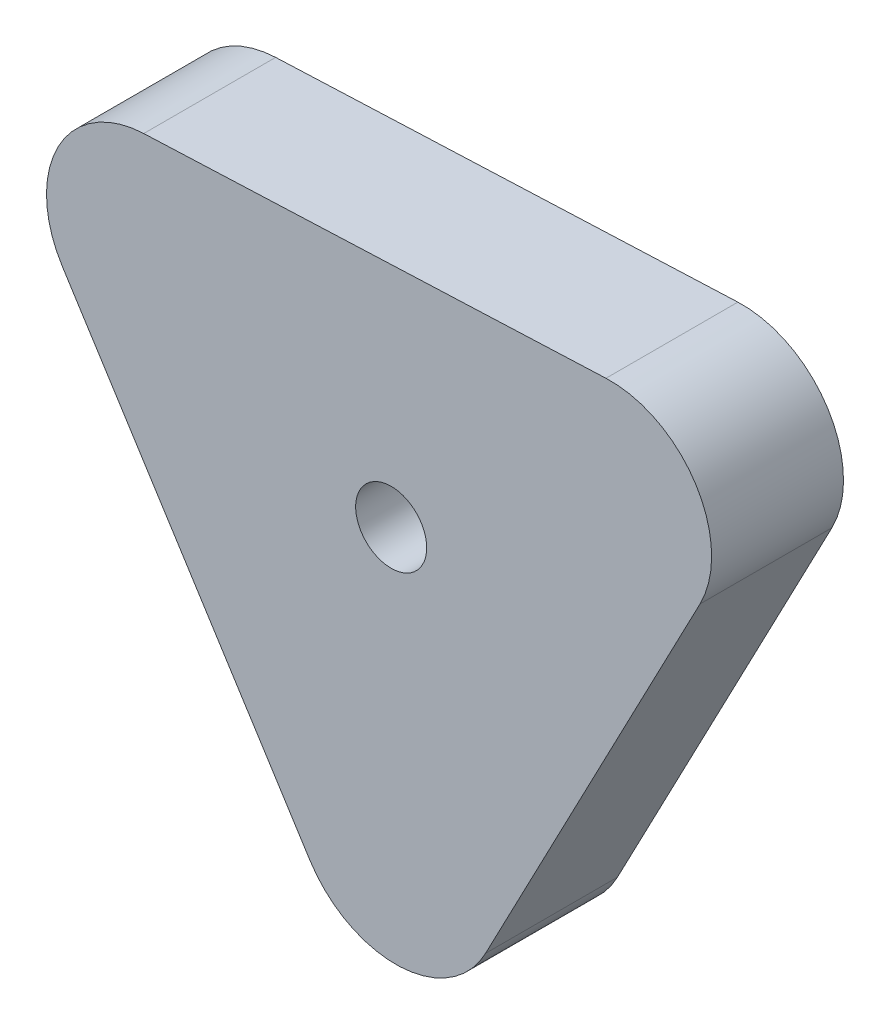
ISO-10303-21;
HEADER;
FILE_DESCRIPTION(('STEP AP214'),'2;1');
FILE_NAME('part.step','',(''),(''),'','','');
FILE_SCHEMA(('AUTOMOTIVE_DESIGN { 1 0 10303 214 1 1 1 1 }'));
ENDSEC;
DATA;
#1=APPLICATION_CONTEXT('core data for automotive mechanical design processes');
#2=APPLICATION_PROTOCOL_DEFINITION('international standard','automotive_design',2000,#1);
#3=PRODUCT_CONTEXT('',#1,'mechanical');
#4=PRODUCT('Part','Part','',(#3));
#5=PRODUCT_RELATED_PRODUCT_CATEGORY('part','',(#4));
#6=PRODUCT_DEFINITION_FORMATION('','',#4);
#7=PRODUCT_DEFINITION_CONTEXT('part definition',#1,'design');
#8=PRODUCT_DEFINITION('design','',#6,#7);
#9=PRODUCT_DEFINITION_SHAPE('','',#8);
#10=(LENGTH_UNIT() NAMED_UNIT(*) SI_UNIT(.MILLI.,.METRE.));
#11=(NAMED_UNIT(*) PLANE_ANGLE_UNIT() SI_UNIT($,.RADIAN.));
#12=(NAMED_UNIT(*) SI_UNIT($,.STERADIAN.) SOLID_ANGLE_UNIT());
#13=UNCERTAINTY_MEASURE_WITH_UNIT(LENGTH_MEASURE(1.E-05),#10,'distance_accuracy_value','');
#14=(GEOMETRIC_REPRESENTATION_CONTEXT(3) GLOBAL_UNCERTAINTY_ASSIGNED_CONTEXT((#13)) GLOBAL_UNIT_ASSIGNED_CONTEXT((#10,
#11,#12)) REPRESENTATION_CONTEXT('',''));
#15=CARTESIAN_POINT('',(0.,0.,0.));
#16=DIRECTION('',(0.,0.,1.));
#17=DIRECTION('',(1.,0.,0.));
#18=AXIS2_PLACEMENT_3D('',#15,#16,#17);
#19=CARTESIAN_POINT('',(20.6420266362112,31.7041270614804,13.));
#20=DIRECTION('',(0.,0.,-1.));
#21=DIRECTION('',(-1.,0.,0.));
#22=AXIS2_PLACEMENT_3D('',#19,#20,#21);
#23=CYLINDRICAL_SURFACE('',#22,10.);
#24=CARTESIAN_POINT('',(20.6420266362112,31.7041270614804,0.));
#25=DIRECTION('',(0.,0.,1.));
#26=DIRECTION('',(1.,0.,0.));
#27=AXIS2_PLACEMENT_3D('',#24,#25,#26);
#28=CIRCLE('',#27,10.);
#29=CARTESIAN_POINT('',(29.5019264332512,27.0670832201512,0.));
#30=VERTEX_POINT('',#29);
#31=CARTESIAN_POINT('',(20.2278745027441,41.6955472813663,0.));
#32=VERTEX_POINT('',#31);
#33=EDGE_CURVE('E116',#30,#32,#28,.T.);
#34=ORIENTED_EDGE('',*,*,#33,.T.);
#35=DIRECTION('',(0.,0.,-1.));
#36=VECTOR('',#35,1.);
#37=CARTESIAN_POINT('',(20.2278745027441,41.6955472813663,13.));
#38=LINE('',#37,#36);
#39=CARTESIAN_POINT('',(20.2278745027441,41.6955472813663,13.));
#40=VERTEX_POINT('',#39);
#41=EDGE_CURVE('E11',#40,#32,#38,.T.);
#42=ORIENTED_EDGE('',*,*,#41,.F.);
#43=CARTESIAN_POINT('',(20.6420266362112,31.7041270614804,13.));
#44=DIRECTION('',(0.,0.,1.));
#45=DIRECTION('',(1.,0.,0.));
#46=AXIS2_PLACEMENT_3D('',#43,#44,#45);
#47=CIRCLE('',#46,10.);
#48=CARTESIAN_POINT('',(29.5019264332512,27.0670832201512,13.));
#49=VERTEX_POINT('',#48);
#50=EDGE_CURVE('E128',#49,#40,#47,.T.);
#51=ORIENTED_EDGE('',*,*,#50,.F.);
#52=DIRECTION('',(0.,0.,-1.));
#53=VECTOR('',#52,1.);
#54=CARTESIAN_POINT('',(29.5019264332512,27.0670832201512,13.));
#55=LINE('',#54,#53);
#56=EDGE_CURVE('E112',#49,#30,#55,.T.);
#57=ORIENTED_EDGE('',*,*,#56,.T.);
#58=EDGE_LOOP('',(#34,#42,#51,#57));
#59=FACE_BOUND('',#58,.T.);
#60=ADVANCED_FACE('F33',(#59),#23,.T.);
#61=CARTESIAN_POINT('',(20.2278745027441,41.6955472813663,13.));
#62=DIRECTION('',(0.0414152133466917,-0.99914202198859,0.));
#63=DIRECTION('',(0.99914202198859,0.0414152133466917,0.));
#64=AXIS2_PLACEMENT_3D('',#61,#62,#63);
#65=PLANE('',#64);
#66=DIRECTION('',(-0.99914202198859,-0.0414152133466917,0.));
#67=VECTOR('',#66,1.);
#68=CARTESIAN_POINT('',(20.2278745027441,41.6955472813663,0.));
#69=LINE('',#68,#67);
#70=CARTESIAN_POINT('',(-25.3356041467235,39.8069056793152,0.));
#71=VERTEX_POINT('',#70);
#72=EDGE_CURVE('E119',#32,#71,#69,.T.);
#73=ORIENTED_EDGE('',*,*,#72,.T.);
#74=DIRECTION('',(0.,0.,-1.));
#75=VECTOR('',#74,1.);
#76=CARTESIAN_POINT('',(-25.3356041467235,39.8069056793152,13.));
#77=LINE('',#76,#75);
#78=CARTESIAN_POINT('',(-25.3356041467235,39.8069056793152,13.));
#79=VERTEX_POINT('',#78);
#80=EDGE_CURVE('E41',#79,#71,#77,.T.);
#81=ORIENTED_EDGE('',*,*,#80,.F.);
#82=DIRECTION('',(-0.99914202198859,-0.0414152133466917,0.));
#83=VECTOR('',#82,1.);
#84=CARTESIAN_POINT('',(20.2278745027441,41.6955472813663,13.));
#85=LINE('',#84,#83);
#86=EDGE_CURVE('E82',#40,#79,#85,.T.);
#87=ORIENTED_EDGE('',*,*,#86,.F.);
#88=ORIENTED_EDGE('',*,*,#41,.T.);
#89=EDGE_LOOP('',(#73,#81,#87,#88));
#90=FACE_BOUND('',#89,.T.);
#91=ADVANCED_FACE('F153',(#90),#65,.F.);
#92=CARTESIAN_POINT('',(-24.9214520132567,29.8154854594293,13.));
#93=DIRECTION('',(0.,0.,-1.));
#94=DIRECTION('',(-1.,0.,0.));
#95=AXIS2_PLACEMENT_3D('',#92,#93,#94);
#96=CYLINDRICAL_SURFACE('',#95,10.);
#97=CARTESIAN_POINT('',(-24.9214520132567,29.8154854594293,0.));
#98=DIRECTION('',(0.,0.,1.));
#99=DIRECTION('',(1.,0.,0.));
#100=AXIS2_PLACEMENT_3D('',#97,#98,#99);
#101=CIRCLE('',#100,10.);
#102=CARTESIAN_POINT('',(-33.3671996768298,24.4611090808724,0.));
#103=VERTEX_POINT('',#102);
#104=EDGE_CURVE('E122',#71,#103,#101,.T.);
#105=ORIENTED_EDGE('',*,*,#104,.T.);
#106=DIRECTION('',(0.,0.,-1.));
#107=VECTOR('',#106,1.);
#108=CARTESIAN_POINT('',(-33.3671996768298,24.4611090808724,13.));
#109=LINE('',#108,#107);
#110=CARTESIAN_POINT('',(-33.3671996768298,24.4611090808724,13.));
#111=VERTEX_POINT('',#110);
#112=EDGE_CURVE('E108',#111,#103,#109,.T.);
#113=ORIENTED_EDGE('',*,*,#112,.F.);
#114=CARTESIAN_POINT('',(-24.9214520132567,29.8154854594293,13.));
#115=DIRECTION('',(0.,0.,1.));
#116=DIRECTION('',(1.,0.,0.));
#117=AXIS2_PLACEMENT_3D('',#114,#115,#116);
#118=CIRCLE('',#117,10.);
#119=EDGE_CURVE('E95',#79,#111,#118,.T.);
#120=ORIENTED_EDGE('',*,*,#119,.F.);
#121=ORIENTED_EDGE('',*,*,#80,.T.);
#122=EDGE_LOOP('',(#105,#113,#120,#121));
#123=FACE_BOUND('',#122,.T.);
#124=ADVANCED_FACE('F134',(#123),#96,.T.);
#125=CARTESIAN_POINT('',(-33.3671996768298,24.4611090808724,13.));
#126=DIRECTION('',(0.844574766357323,0.535437637855682,0.));
#127=DIRECTION('',(-0.535437637855682,0.844574766357323,0.));
#128=AXIS2_PLACEMENT_3D('',#125,#126,#127);
#129=PLANE('',#128);
#130=DIRECTION('',(0.535437637855682,-0.844574766357323,0.));
#131=VECTOR('',#130,1.);
#132=CARTESIAN_POINT('',(-33.3671996768298,24.4611090808724,0.));
#133=LINE('',#132,#131);
#134=CARTESIAN_POINT('',(-8.94984874607566,-14.0537001133309,0.));
#135=VERTEX_POINT('',#134);
#136=EDGE_CURVE('E104',#103,#135,#133,.T.);
#137=ORIENTED_EDGE('',*,*,#136,.T.);
#138=DIRECTION('',(0.,0.,-1.));
#139=VECTOR('',#138,1.);
#140=CARTESIAN_POINT('',(-8.94984874607566,-14.0537001133309,13.));
#141=LINE('',#140,#139);
#142=CARTESIAN_POINT('',(-8.94984874607566,-14.0537001133309,13.));
#143=VERTEX_POINT('',#142);
#144=EDGE_CURVE('E101',#143,#135,#141,.T.);
#145=ORIENTED_EDGE('',*,*,#144,.F.);
#146=DIRECTION('',(0.535437637855682,-0.844574766357323,0.));
#147=VECTOR('',#146,1.);
#148=CARTESIAN_POINT('',(-33.3671996768298,24.4611090808724,13.));
#149=LINE('',#148,#147);
#150=EDGE_CURVE('E89',#111,#143,#149,.T.);
#151=ORIENTED_EDGE('',*,*,#150,.F.);
#152=ORIENTED_EDGE('',*,*,#112,.T.);
#153=EDGE_LOOP('',(#137,#145,#151,#152));
#154=FACE_BOUND('',#153,.T.);
#155=ADVANCED_FACE('F102',(#154),#129,.F.);
#156=CARTESIAN_POINT('',(-0.504101082502347,-8.69932373477416,13.));
#157=DIRECTION('',(0.,0.,-1.));
#158=DIRECTION('',(-1.,0.,0.));
#159=AXIS2_PLACEMENT_3D('',#156,#157,#158);
#160=CYLINDRICAL_SURFACE('',#159,10.);
#161=CARTESIAN_POINT('',(-0.504101082502347,-8.69932373477416,0.));
#162=DIRECTION('',(0.,0.,-1.));
#163=DIRECTION('',(-1.,0.,0.));
#164=AXIS2_PLACEMENT_3D('',#161,#162,#163);
#165=CIRCLE('',#164,10.);
#166=CARTESIAN_POINT('',(8.35579871453787,-13.3363675761031,0.));
#167=VERTEX_POINT('',#166);
#168=EDGE_CURVE('E125',#167,#135,#165,.T.);
#169=ORIENTED_EDGE('',*,*,#168,.F.);
#170=DIRECTION('',(0.,0.,-1.));
#171=VECTOR('',#170,1.);
#172=CARTESIAN_POINT('',(8.35579871453787,-13.3363675761031,13.));
#173=LINE('',#172,#171);
#174=CARTESIAN_POINT('',(8.35579871453787,-13.3363675761031,13.));
#175=VERTEX_POINT('',#174);
#176=EDGE_CURVE('E71',#175,#167,#173,.T.);
#177=ORIENTED_EDGE('',*,*,#176,.F.);
#178=CARTESIAN_POINT('',(-0.504101082502347,-8.69932373477416,13.));
#179=DIRECTION('',(0.,0.,-1.));
#180=DIRECTION('',(-1.,0.,0.));
#181=AXIS2_PLACEMENT_3D('',#178,#179,#180);
#182=CIRCLE('',#181,10.);
#183=EDGE_CURVE('E93',#175,#143,#182,.T.);
#184=ORIENTED_EDGE('',*,*,#183,.T.);
#185=ORIENTED_EDGE('',*,*,#144,.T.);
#186=EDGE_LOOP('',(#169,#177,#184,#185));
#187=FACE_BOUND('',#186,.T.);
#188=ADVANCED_FACE('F110',(#187),#160,.T.);
#189=CARTESIAN_POINT('',(8.35579871453787,-13.3363675761031,13.));
#190=DIRECTION('',(-0.885989979704015,0.463704384132908,0.));
#191=DIRECTION('',(-0.463704384132908,-0.885989979704015,0.));
#192=AXIS2_PLACEMENT_3D('',#189,#190,#191);
#193=PLANE('',#192);
#194=DIRECTION('',(0.463704384132908,0.885989979704015,0.));
#195=VECTOR('',#194,1.);
#196=CARTESIAN_POINT('',(8.35579871453787,-13.3363675761031,0.));
#197=LINE('',#196,#195);
#198=EDGE_CURVE('E74',#167,#30,#197,.T.);
#199=ORIENTED_EDGE('',*,*,#198,.T.);
#200=ORIENTED_EDGE('',*,*,#56,.F.);
#201=DIRECTION('',(0.463704384132908,0.885989979704015,0.));
#202=VECTOR('',#201,1.);
#203=CARTESIAN_POINT('',(8.35579871453787,-13.3363675761031,13.));
#204=LINE('',#203,#202);
#205=EDGE_CURVE('E49',#175,#49,#204,.T.);
#206=ORIENTED_EDGE('',*,*,#205,.F.);
#207=ORIENTED_EDGE('',*,*,#176,.T.);
#208=EDGE_LOOP('',(#199,#200,#206,#207));
#209=FACE_BOUND('',#208,.T.);
#210=ADVANCED_FACE('F141',(#209),#193,.F.);
#211=CARTESIAN_POINT('',(20.6420266362112,31.7041270614804,13.));
#212=DIRECTION('',(0.,0.,1.));
#213=DIRECTION('',(1.,0.,0.));
#214=AXIS2_PLACEMENT_3D('',#211,#212,#213);
#215=PLANE('',#214);
#216=CARTESIAN_POINT('',(-0.945044174358145,18.3858963458237,13.));
#217=DIRECTION('',(0.,0.,1.));
#218=DIRECTION('',(1.,0.,0.));
#219=AXIS2_PLACEMENT_3D('',#216,#217,#218);
#220=CIRCLE('',#219,3.5);
#221=CARTESIAN_POINT('',(2.55495582564185,18.3858963458237,13.));
#222=VERTEX_POINT('',#221);
#223=EDGE_CURVE('E208',#222,#222,#220,.T.);
#224=ORIENTED_EDGE('',*,*,#223,.F.);
#225=EDGE_LOOP('',(#224));
#226=FACE_BOUND('',#225,.T.);
#227=ORIENTED_EDGE('',*,*,#50,.T.);
#228=ORIENTED_EDGE('',*,*,#86,.T.);
#229=ORIENTED_EDGE('',*,*,#119,.T.);
#230=ORIENTED_EDGE('',*,*,#150,.T.);
#231=ORIENTED_EDGE('',*,*,#183,.F.);
#232=ORIENTED_EDGE('',*,*,#205,.T.);
#233=EDGE_LOOP('',(#227,#228,#229,#230,#231,#232));
#234=FACE_BOUND('',#233,.T.);
#235=ADVANCED_FACE('F91',(#226,#234),#215,.T.);
#236=CARTESIAN_POINT('',(20.6420266362112,31.7041270614804,0.));
#237=DIRECTION('',(0.,0.,1.));
#238=DIRECTION('',(1.,0.,0.));
#239=AXIS2_PLACEMENT_3D('',#236,#237,#238);
#240=PLANE('',#239);
#241=CARTESIAN_POINT('',(-0.945044174358145,18.3858963458237,0.));
#242=DIRECTION('',(0.,0.,1.));
#243=DIRECTION('',(1.,0.,0.));
#244=AXIS2_PLACEMENT_3D('',#241,#242,#243);
#245=CIRCLE('',#244,3.5);
#246=CARTESIAN_POINT('',(2.55495582564185,18.3858963458237,0.));
#247=VERTEX_POINT('',#246);
#248=EDGE_CURVE('E120',#247,#247,#245,.T.);
#249=ORIENTED_EDGE('',*,*,#248,.T.);
#250=EDGE_LOOP('',(#249));
#251=FACE_BOUND('',#250,.T.);
#252=ORIENTED_EDGE('',*,*,#33,.F.);
#253=ORIENTED_EDGE('',*,*,#198,.F.);
#254=ORIENTED_EDGE('',*,*,#168,.T.);
#255=ORIENTED_EDGE('',*,*,#136,.F.);
#256=ORIENTED_EDGE('',*,*,#104,.F.);
#257=ORIENTED_EDGE('',*,*,#72,.F.);
#258=EDGE_LOOP('',(#252,#253,#254,#255,#256,#257));
#259=FACE_BOUND('',#258,.T.);
#260=ADVANCED_FACE('F137',(#251,#259),#240,.F.);
#261=CARTESIAN_POINT('',(-0.945044174358145,18.3858963458237,0.));
#262=DIRECTION('',(0.,0.,1.));
#263=DIRECTION('',(1.,0.,0.));
#264=AXIS2_PLACEMENT_3D('',#261,#262,#263);
#265=CYLINDRICAL_SURFACE('',#264,3.5);
#266=CARTESIAN_POINT('',(2.55495582564185,18.3858963458237,0.));
#267=CARTESIAN_POINT('',(2.55495582564185,18.3858963458237,0.135416666666666));
#268=CARTESIAN_POINT('',(2.55495582564185,18.3858963458237,0.270833333333333));
#269=CARTESIAN_POINT('',(2.55495582564185,18.3858963458237,0.541666666666667));
#270=CARTESIAN_POINT('',(2.55495582564185,18.3858963458237,0.677083333333333));
#271=CARTESIAN_POINT('',(2.55495582564185,18.3858963458237,0.947916666666667));
#272=CARTESIAN_POINT('',(2.55495582564185,18.3858963458237,1.08333333333333));
#273=CARTESIAN_POINT('',(2.55495582564185,18.3858963458237,1.35416666666667));
#274=CARTESIAN_POINT('',(2.55495582564185,18.3858963458237,1.48958333333333));
#275=CARTESIAN_POINT('',(2.55495582564185,18.3858963458237,1.76041666666667));
#276=CARTESIAN_POINT('',(2.55495582564185,18.3858963458237,1.89583333333333));
#277=CARTESIAN_POINT('',(2.55495582564185,18.3858963458237,2.16666666666667));
#278=CARTESIAN_POINT('',(2.55495582564185,18.3858963458237,2.30208333333333));
#279=CARTESIAN_POINT('',(2.55495582564185,18.3858963458237,2.57291666666667));
#280=CARTESIAN_POINT('',(2.55495582564185,18.3858963458237,2.70833333333333));
#281=CARTESIAN_POINT('',(2.55495582564185,18.3858963458237,2.97916666666667));
#282=CARTESIAN_POINT('',(2.55495582564185,18.3858963458237,3.11458333333333));
#283=CARTESIAN_POINT('',(2.55495582564185,18.3858963458237,3.38541666666667));
#284=CARTESIAN_POINT('',(2.55495582564185,18.3858963458237,3.52083333333333));
#285=CARTESIAN_POINT('',(2.55495582564185,18.3858963458237,3.79166666666667));
#286=CARTESIAN_POINT('',(2.55495582564185,18.3858963458237,3.92708333333333));
#287=CARTESIAN_POINT('',(2.55495582564185,18.3858963458237,4.19791666666667));
#288=CARTESIAN_POINT('',(2.55495582564185,18.3858963458237,4.33333333333333));
#289=CARTESIAN_POINT('',(2.55495582564185,18.3858963458237,4.60416666666667));
#290=CARTESIAN_POINT('',(2.55495582564185,18.3858963458237,4.73958333333333));
#291=CARTESIAN_POINT('',(2.55495582564185,18.3858963458237,5.01041666666667));
#292=CARTESIAN_POINT('',(2.55495582564185,18.3858963458237,5.14583333333333));
#293=CARTESIAN_POINT('',(2.55495582564185,18.3858963458237,5.41666666666667));
#294=CARTESIAN_POINT('',(2.55495582564185,18.3858963458237,5.55208333333333));
#295=CARTESIAN_POINT('',(2.55495582564185,18.3858963458237,5.82291666666667));
#296=CARTESIAN_POINT('',(2.55495582564185,18.3858963458237,5.95833333333333));
#297=CARTESIAN_POINT('',(2.55495582564185,18.3858963458237,6.22916666666667));
#298=CARTESIAN_POINT('',(2.55495582564185,18.3858963458237,6.36458333333333));
#299=CARTESIAN_POINT('',(2.55495582564185,18.3858963458237,6.63541666666667));
#300=CARTESIAN_POINT('',(2.55495582564185,18.3858963458237,6.77083333333333));
#301=CARTESIAN_POINT('',(2.55495582564185,18.3858963458237,7.04166666666667));
#302=CARTESIAN_POINT('',(2.55495582564185,18.3858963458237,7.17708333333333));
#303=CARTESIAN_POINT('',(2.55495582564185,18.3858963458237,7.44791666666667));
#304=CARTESIAN_POINT('',(2.55495582564185,18.3858963458237,7.58333333333333));
#305=CARTESIAN_POINT('',(2.55495582564185,18.3858963458237,7.85416666666667));
#306=CARTESIAN_POINT('',(2.55495582564185,18.3858963458237,7.98958333333333));
#307=CARTESIAN_POINT('',(2.55495582564185,18.3858963458237,8.26041666666667));
#308=CARTESIAN_POINT('',(2.55495582564185,18.3858963458237,8.39583333333333));
#309=CARTESIAN_POINT('',(2.55495582564185,18.3858963458237,8.66666666666667));
#310=CARTESIAN_POINT('',(2.55495582564185,18.3858963458237,8.80208333333333));
#311=CARTESIAN_POINT('',(2.55495582564185,18.3858963458237,9.07291666666667));
#312=CARTESIAN_POINT('',(2.55495582564185,18.3858963458237,9.20833333333333));
#313=CARTESIAN_POINT('',(2.55495582564185,18.3858963458237,9.47916666666667));
#314=CARTESIAN_POINT('',(2.55495582564185,18.3858963458237,9.61458333333333));
#315=CARTESIAN_POINT('',(2.55495582564185,18.3858963458237,9.88541666666667));
#316=CARTESIAN_POINT('',(2.55495582564185,18.3858963458237,10.0208333333333));
#317=CARTESIAN_POINT('',(2.55495582564185,18.3858963458237,10.2916666666667));
#318=CARTESIAN_POINT('',(2.55495582564185,18.3858963458237,10.4270833333333));
#319=CARTESIAN_POINT('',(2.55495582564185,18.3858963458237,10.6979166666667));
#320=CARTESIAN_POINT('',(2.55495582564185,18.3858963458237,10.8333333333333));
#321=CARTESIAN_POINT('',(2.55495582564185,18.3858963458237,11.1041666666667));
#322=CARTESIAN_POINT('',(2.55495582564185,18.3858963458237,11.2395833333333));
#323=CARTESIAN_POINT('',(2.55495582564185,18.3858963458237,11.5104166666667));
#324=CARTESIAN_POINT('',(2.55495582564185,18.3858963458237,11.6458333333333));
#325=CARTESIAN_POINT('',(2.55495582564185,18.3858963458237,11.9166666666667));
#326=CARTESIAN_POINT('',(2.55495582564185,18.3858963458237,12.0520833333333));
#327=CARTESIAN_POINT('',(2.55495582564185,18.3858963458237,12.3229166666667));
#328=CARTESIAN_POINT('',(2.55495582564185,18.3858963458237,12.4583333333333));
#329=CARTESIAN_POINT('',(2.55495582564185,18.3858963458237,12.7291666666667));
#330=CARTESIAN_POINT('',(2.55495582564185,18.3858963458237,12.8645833333333));
#331=CARTESIAN_POINT('',(2.55495582564185,18.3858963458237,13.));
#332=B_SPLINE_CURVE_WITH_KNOTS('',3,(#266,#267,#268,#269,#270,#271,#272,#273,#274,#275,#276,
#277,#278,#279,#280,#281,#282,#283,#284,#285,#286,#287,#288,#289,#290,#291,#292,#293,#294,#295,
#296,#297,#298,#299,#300,#301,#302,#303,#304,#305,#306,#307,#308,#309,#310,#311,#312,#313,#314,
#315,#316,#317,#318,#319,#320,#321,#322,#323,#324,#325,#326,#327,#328,#329,#330,#331),
.UNSPECIFIED.,.F.,.F.,(4,2,2,2,2,2,2,2,2,2,2,2,2,2,2,2,2,2,2,2,2,2,2,2,2,2,2,2,2,2,2,2,4),(0.,
0.40625,0.8125,1.21875,1.625,2.03125,2.4375,2.84375,3.25,3.65625,4.0625,4.46875,4.875,5.28125,
5.6875,6.09375,6.5,6.90625,7.3125,7.71875,8.125,8.53125,8.9375,9.34375,9.75,10.15625,10.5625,
10.96875,11.375,11.78125,12.1875,12.59375,13.),.UNSPECIFIED.);
#333=EDGE_CURVE('BSEAM190',#247,#222,#332,.T.);
#334=ORIENTED_EDGE('',*,*,#248,.F.);
#335=ORIENTED_EDGE('',*,*,#223,.T.);
#336=ORIENTED_EDGE('',*,*,#333,.T.);
#337=ORIENTED_EDGE('',*,*,#333,.F.);
#338=EDGE_LOOP('',(#334,#336,#335,#337));
#339=FACE_BOUND('',#338,.T.);
#340=ADVANCED_FACE('F190',(#339),#265,.F.);
#341=CLOSED_SHELL('',(#60,#91,#124,#155,#188,#210,#235,#260,#340));
#342=MANIFOLD_SOLID_BREP('B2',#341);
#343=ADVANCED_BREP_SHAPE_REPRESENTATION('',(#18,#342),#14);
#344=SHAPE_DEFINITION_REPRESENTATION(#9,#343);
ENDSEC;
END-ISO-10303-21;
